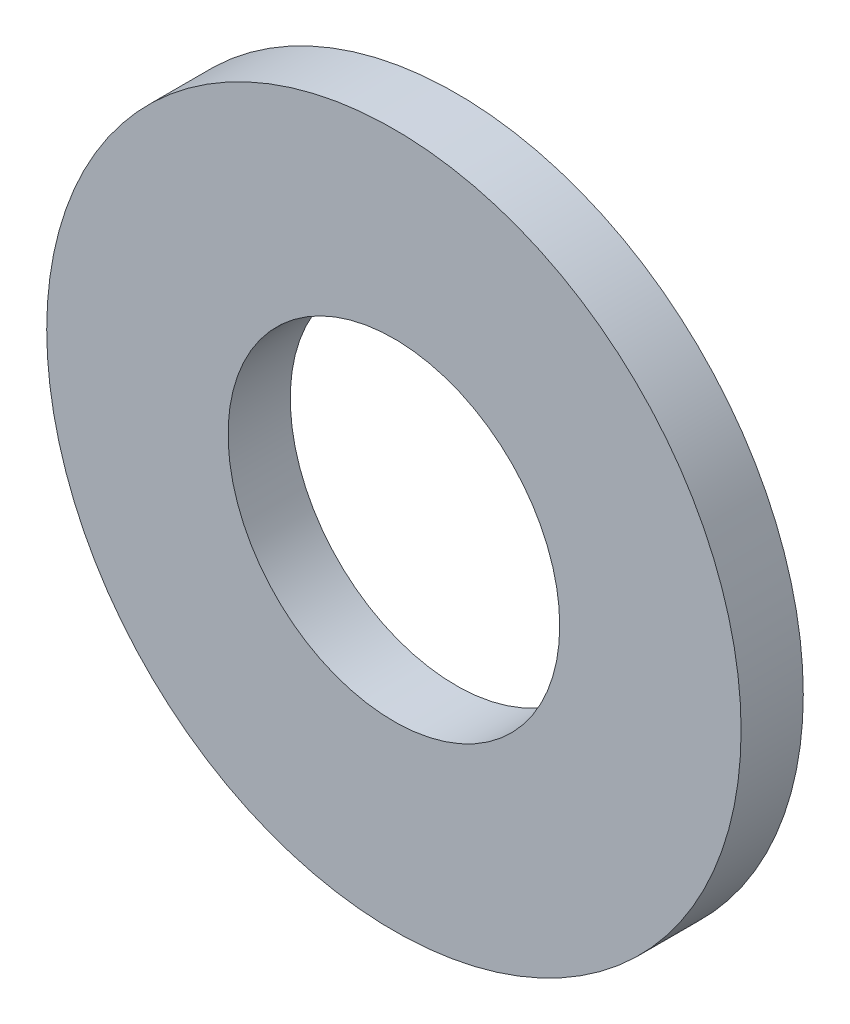
ISO-10303-21;
HEADER;
FILE_DESCRIPTION(('STEP AP214'),'2;1');
FILE_NAME('part.step','',(''),(''),'','','');
FILE_SCHEMA(('AUTOMOTIVE_DESIGN { 1 0 10303 214 1 1 1 1 }'));
ENDSEC;
DATA;
#1=APPLICATION_CONTEXT('core data for automotive mechanical design processes');
#2=APPLICATION_PROTOCOL_DEFINITION('international standard','automotive_design',2000,#1);
#3=PRODUCT_CONTEXT('',#1,'mechanical');
#4=PRODUCT('Part','Part','',(#3));
#5=PRODUCT_RELATED_PRODUCT_CATEGORY('part','',(#4));
#6=PRODUCT_DEFINITION_FORMATION('','',#4);
#7=PRODUCT_DEFINITION_CONTEXT('part definition',#1,'design');
#8=PRODUCT_DEFINITION('design','',#6,#7);
#9=PRODUCT_DEFINITION_SHAPE('','',#8);
#10=(LENGTH_UNIT() NAMED_UNIT(*) SI_UNIT(.MILLI.,.METRE.));
#11=(NAMED_UNIT(*) PLANE_ANGLE_UNIT() SI_UNIT($,.RADIAN.));
#12=(NAMED_UNIT(*) SI_UNIT($,.STERADIAN.) SOLID_ANGLE_UNIT());
#13=UNCERTAINTY_MEASURE_WITH_UNIT(LENGTH_MEASURE(1.E-05),#10,'distance_accuracy_value','');
#14=(GEOMETRIC_REPRESENTATION_CONTEXT(3) GLOBAL_UNCERTAINTY_ASSIGNED_CONTEXT((#13)) GLOBAL_UNIT_ASSIGNED_CONTEXT((#10,
#11,#12)) REPRESENTATION_CONTEXT('',''));
#15=CARTESIAN_POINT('',(0.,0.,0.));
#16=DIRECTION('',(0.,0.,1.));
#17=DIRECTION('',(1.,0.,0.));
#18=AXIS2_PLACEMENT_3D('',#15,#16,#17);
#19=CARTESIAN_POINT('',(0.,0.,0.6));
#20=DIRECTION('',(0.,0.,1.));
#21=DIRECTION('',(1.,0.,0.));
#22=AXIS2_PLACEMENT_3D('',#19,#20,#21);
#23=PLANE('',#22);
#24=CARTESIAN_POINT('',(0.,0.,0.6));
#25=DIRECTION('',(0.,0.,1.));
#26=DIRECTION('',(1.,0.,0.));
#27=AXIS2_PLACEMENT_3D('',#24,#25,#26);
#28=CIRCLE('',#27,3.35);
#29=CARTESIAN_POINT('',(3.35,0.,0.6));
#30=VERTEX_POINT('',#29);
#31=EDGE_CURVE('E10',#30,#30,#28,.T.);
#32=ORIENTED_EDGE('',*,*,#31,.T.);
#33=EDGE_LOOP('',(#32));
#34=FACE_BOUND('',#33,.T.);
#35=CARTESIAN_POINT('',(0.,0.,0.6));
#36=DIRECTION('',(0.,0.,1.));
#37=DIRECTION('',(1.,0.,0.));
#38=AXIS2_PLACEMENT_3D('',#35,#36,#37);
#39=CIRCLE('',#38,1.6);
#40=CARTESIAN_POINT('',(1.6,0.,0.6));
#41=VERTEX_POINT('',#40);
#42=EDGE_CURVE('E48',#41,#41,#39,.T.);
#43=ORIENTED_EDGE('',*,*,#42,.F.);
#44=EDGE_LOOP('',(#43));
#45=FACE_BOUND('',#44,.T.);
#46=ADVANCED_FACE('F37',(#34,#45),#23,.T.);
#47=CARTESIAN_POINT('',(0.,0.,0.));
#48=DIRECTION('',(0.,0.,1.));
#49=DIRECTION('',(1.,0.,0.));
#50=AXIS2_PLACEMENT_3D('',#47,#48,#49);
#51=PLANE('',#50);
#52=CARTESIAN_POINT('',(0.,0.,0.));
#53=DIRECTION('',(0.,0.,1.));
#54=DIRECTION('',(1.,0.,0.));
#55=AXIS2_PLACEMENT_3D('',#52,#53,#54);
#56=CIRCLE('',#55,3.35);
#57=CARTESIAN_POINT('',(3.35,0.,0.));
#58=VERTEX_POINT('',#57);
#59=EDGE_CURVE('E41',#58,#58,#56,.T.);
#60=ORIENTED_EDGE('',*,*,#59,.F.);
#61=EDGE_LOOP('',(#60));
#62=FACE_BOUND('',#61,.T.);
#63=CARTESIAN_POINT('',(0.,0.,0.));
#64=DIRECTION('',(0.,0.,1.));
#65=DIRECTION('',(1.,0.,0.));
#66=AXIS2_PLACEMENT_3D('',#63,#64,#65);
#67=CIRCLE('',#66,1.6);
#68=CARTESIAN_POINT('',(1.6,0.,0.));
#69=VERTEX_POINT('',#68);
#70=EDGE_CURVE('E50',#69,#69,#67,.T.);
#71=ORIENTED_EDGE('',*,*,#70,.T.);
#72=EDGE_LOOP('',(#71));
#73=FACE_BOUND('',#72,.T.);
#74=ADVANCED_FACE('F60',(#62,#73),#51,.F.);
#75=CARTESIAN_POINT('',(0.,0.,0.6));
#76=DIRECTION('',(0.,0.,-1.));
#77=DIRECTION('',(-1.,0.,0.));
#78=AXIS2_PLACEMENT_3D('',#75,#76,#77);
#79=CYLINDRICAL_SURFACE('',#78,3.35);
#80=ORIENTED_EDGE('',*,*,#31,.F.);
#81=EDGE_LOOP('',(#80));
#82=FACE_BOUND('',#81,.T.);
#83=ORIENTED_EDGE('',*,*,#59,.T.);
#84=EDGE_LOOP('',(#83));
#85=FACE_BOUND('',#84,.T.);
#86=ADVANCED_FACE('F39',(#82,#85),#79,.T.);
#87=CARTESIAN_POINT('',(0.,0.,0.6));
#88=DIRECTION('',(0.,0.,-1.));
#89=DIRECTION('',(-1.,0.,0.));
#90=AXIS2_PLACEMENT_3D('',#87,#88,#89);
#91=CYLINDRICAL_SURFACE('',#90,1.6);
#92=ORIENTED_EDGE('',*,*,#42,.T.);
#93=EDGE_LOOP('',(#92));
#94=FACE_BOUND('',#93,.T.);
#95=ORIENTED_EDGE('',*,*,#70,.F.);
#96=EDGE_LOOP('',(#95));
#97=FACE_BOUND('',#96,.T.);
#98=ADVANCED_FACE('F56',(#94,#97),#91,.F.);
#99=CLOSED_SHELL('',(#46,#74,#86,#98));
#100=MANIFOLD_SOLID_BREP('B2',#99);
#101=ADVANCED_BREP_SHAPE_REPRESENTATION('',(#18,#100),#14);
#102=SHAPE_DEFINITION_REPRESENTATION(#9,#101);
ENDSEC;
END-ISO-10303-21;
